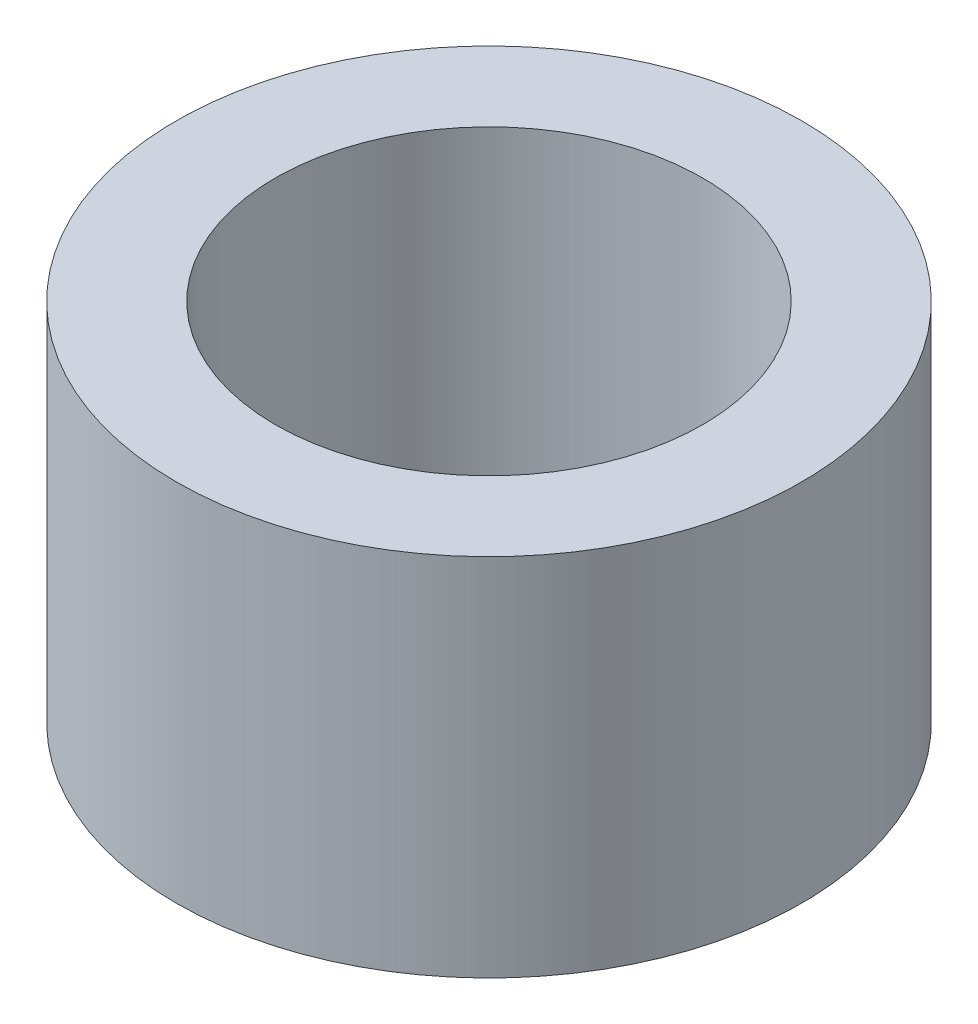
ISO-10303-21;
HEADER;
FILE_DESCRIPTION(('STEP AP214'),'2;1');
FILE_NAME('part.step','',(''),(''),'','','');
FILE_SCHEMA(('AUTOMOTIVE_DESIGN { 1 0 10303 214 1 1 1 1 }'));
ENDSEC;
DATA;
#1=APPLICATION_CONTEXT('core data for automotive mechanical design processes');
#2=APPLICATION_PROTOCOL_DEFINITION('international standard','automotive_design',2000,#1);
#3=PRODUCT_CONTEXT('',#1,'mechanical');
#4=PRODUCT('Part','Part','',(#3));
#5=PRODUCT_RELATED_PRODUCT_CATEGORY('part','',(#4));
#6=PRODUCT_DEFINITION_FORMATION('','',#4);
#7=PRODUCT_DEFINITION_CONTEXT('part definition',#1,'design');
#8=PRODUCT_DEFINITION('design','',#6,#7);
#9=PRODUCT_DEFINITION_SHAPE('','',#8);
#10=(LENGTH_UNIT() NAMED_UNIT(*) SI_UNIT(.MILLI.,.METRE.));
#11=(NAMED_UNIT(*) PLANE_ANGLE_UNIT() SI_UNIT($,.RADIAN.));
#12=(NAMED_UNIT(*) SI_UNIT($,.STERADIAN.) SOLID_ANGLE_UNIT());
#13=UNCERTAINTY_MEASURE_WITH_UNIT(LENGTH_MEASURE(1.E-05),#10,'distance_accuracy_value','');
#14=(GEOMETRIC_REPRESENTATION_CONTEXT(3) GLOBAL_UNCERTAINTY_ASSIGNED_CONTEXT((#13)) GLOBAL_UNIT_ASSIGNED_CONTEXT((#10,
#11,#12)) REPRESENTATION_CONTEXT('',''));
#15=CARTESIAN_POINT('',(0.,0.,0.));
#16=DIRECTION('',(0.,0.,1.));
#17=DIRECTION('',(1.,0.,0.));
#18=AXIS2_PLACEMENT_3D('',#15,#16,#17);
#19=CARTESIAN_POINT('',(0.,7.,0.));
#20=DIRECTION('',(0.,1.,0.));
#21=DIRECTION('',(0.,0.,1.));
#22=AXIS2_PLACEMENT_3D('',#19,#20,#21);
#23=PLANE('',#22);
#24=CARTESIAN_POINT('',(0.,7.,0.));
#25=DIRECTION('',(0.,1.,0.));
#26=DIRECTION('',(0.,0.,1.));
#27=AXIS2_PLACEMENT_3D('',#24,#25,#26);
#28=CIRCLE('',#27,6.);
#29=CARTESIAN_POINT('',(0.,7.,6.));
#30=VERTEX_POINT('',#29);
#31=EDGE_CURVE('E10',#30,#30,#28,.T.);
#32=ORIENTED_EDGE('',*,*,#31,.T.);
#33=EDGE_LOOP('',(#32));
#34=FACE_BOUND('',#33,.T.);
#35=CARTESIAN_POINT('',(0.,7.,0.));
#36=DIRECTION('',(0.,1.,0.));
#37=DIRECTION('',(0.,0.,1.));
#38=AXIS2_PLACEMENT_3D('',#35,#36,#37);
#39=CIRCLE('',#38,4.1);
#40=CARTESIAN_POINT('',(0.,7.,4.1));
#41=VERTEX_POINT('',#40);
#42=EDGE_CURVE('E42',#41,#41,#39,.T.);
#43=ORIENTED_EDGE('',*,*,#42,.F.);
#44=EDGE_LOOP('',(#43));
#45=FACE_BOUND('',#44,.T.);
#46=ADVANCED_FACE('F31',(#34,#45),#23,.T.);
#47=CARTESIAN_POINT('',(0.,0.,0.));
#48=DIRECTION('',(0.,1.,0.));
#49=DIRECTION('',(0.,0.,1.));
#50=AXIS2_PLACEMENT_3D('',#47,#48,#49);
#51=PLANE('',#50);
#52=CARTESIAN_POINT('',(0.,0.,0.));
#53=DIRECTION('',(0.,1.,0.));
#54=DIRECTION('',(0.,0.,1.));
#55=AXIS2_PLACEMENT_3D('',#52,#53,#54);
#56=CIRCLE('',#55,6.);
#57=CARTESIAN_POINT('',(0.,0.,6.));
#58=VERTEX_POINT('',#57);
#59=EDGE_CURVE('E35',#58,#58,#56,.T.);
#60=ORIENTED_EDGE('',*,*,#59,.F.);
#61=EDGE_LOOP('',(#60));
#62=FACE_BOUND('',#61,.T.);
#63=CARTESIAN_POINT('',(0.,0.,0.));
#64=DIRECTION('',(0.,1.,0.));
#65=DIRECTION('',(0.,0.,1.));
#66=AXIS2_PLACEMENT_3D('',#63,#64,#65);
#67=CIRCLE('',#66,4.1);
#68=CARTESIAN_POINT('',(0.,0.,4.1));
#69=VERTEX_POINT('',#68);
#70=EDGE_CURVE('E44',#69,#69,#67,.T.);
#71=ORIENTED_EDGE('',*,*,#70,.T.);
#72=EDGE_LOOP('',(#71));
#73=FACE_BOUND('',#72,.T.);
#74=ADVANCED_FACE('F54',(#62,#73),#51,.F.);
#75=CARTESIAN_POINT('',(0.,7.,0.));
#76=DIRECTION('',(0.,-1.,0.));
#77=DIRECTION('',(0.,0.,-1.));
#78=AXIS2_PLACEMENT_3D('',#75,#76,#77);
#79=CYLINDRICAL_SURFACE('',#78,6.);
#80=ORIENTED_EDGE('',*,*,#31,.F.);
#81=EDGE_LOOP('',(#80));
#82=FACE_BOUND('',#81,.T.);
#83=ORIENTED_EDGE('',*,*,#59,.T.);
#84=EDGE_LOOP('',(#83));
#85=FACE_BOUND('',#84,.T.);
#86=ADVANCED_FACE('F33',(#82,#85),#79,.T.);
#87=CARTESIAN_POINT('',(0.,7.,0.));
#88=DIRECTION('',(0.,-1.,0.));
#89=DIRECTION('',(0.,0.,-1.));
#90=AXIS2_PLACEMENT_3D('',#87,#88,#89);
#91=CYLINDRICAL_SURFACE('',#90,4.1);
#92=ORIENTED_EDGE('',*,*,#42,.T.);
#93=EDGE_LOOP('',(#92));
#94=FACE_BOUND('',#93,.T.);
#95=ORIENTED_EDGE('',*,*,#70,.F.);
#96=EDGE_LOOP('',(#95));
#97=FACE_BOUND('',#96,.T.);
#98=ADVANCED_FACE('F50',(#94,#97),#91,.F.);
#99=CLOSED_SHELL('',(#46,#74,#86,#98));
#100=MANIFOLD_SOLID_BREP('B2',#99);
#101=ADVANCED_BREP_SHAPE_REPRESENTATION('',(#18,#100),#14);
#102=SHAPE_DEFINITION_REPRESENTATION(#9,#101);
ENDSEC;
END-ISO-10303-21;
